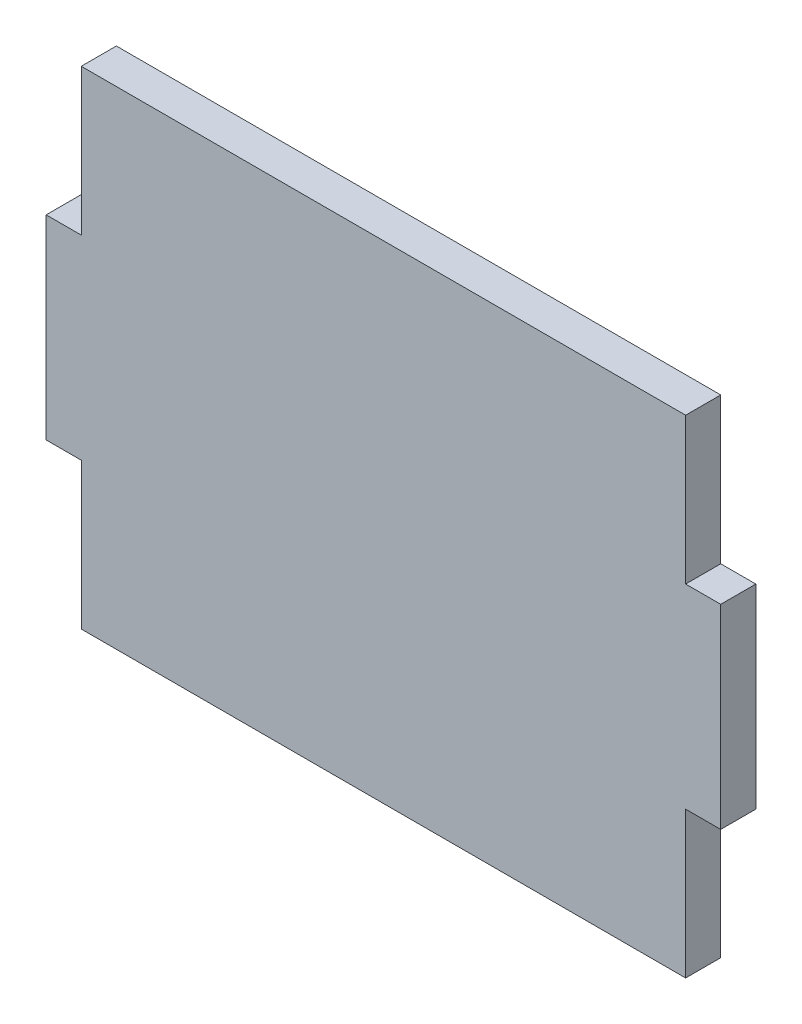
ISO-10303-21;
HEADER;
FILE_DESCRIPTION(('STEP AP214'),'2;1');
FILE_NAME('part.step','',(''),(''),'','','');
FILE_SCHEMA(('AUTOMOTIVE_DESIGN { 1 0 10303 214 1 1 1 1 }'));
ENDSEC;
DATA;
#1=APPLICATION_CONTEXT('core data for automotive mechanical design processes');
#2=APPLICATION_PROTOCOL_DEFINITION('international standard','automotive_design',2000,#1);
#3=PRODUCT_CONTEXT('',#1,'mechanical');
#4=PRODUCT('Part','Part','',(#3));
#5=PRODUCT_RELATED_PRODUCT_CATEGORY('part','',(#4));
#6=PRODUCT_DEFINITION_FORMATION('','',#4);
#7=PRODUCT_DEFINITION_CONTEXT('part definition',#1,'design');
#8=PRODUCT_DEFINITION('design','',#6,#7);
#9=PRODUCT_DEFINITION_SHAPE('','',#8);
#10=(LENGTH_UNIT() NAMED_UNIT(*) SI_UNIT(.MILLI.,.METRE.));
#11=(NAMED_UNIT(*) PLANE_ANGLE_UNIT() SI_UNIT($,.RADIAN.));
#12=(NAMED_UNIT(*) SI_UNIT($,.STERADIAN.) SOLID_ANGLE_UNIT());
#13=UNCERTAINTY_MEASURE_WITH_UNIT(LENGTH_MEASURE(1.E-05),#10,'distance_accuracy_value','');
#14=(GEOMETRIC_REPRESENTATION_CONTEXT(3) GLOBAL_UNCERTAINTY_ASSIGNED_CONTEXT((#13)) GLOBAL_UNIT_ASSIGNED_CONTEXT((#10,
#11,#12)) REPRESENTATION_CONTEXT('',''));
#15=CARTESIAN_POINT('',(0.,0.,0.));
#16=DIRECTION('',(0.,0.,1.));
#17=DIRECTION('',(1.,0.,0.));
#18=AXIS2_PLACEMENT_3D('',#15,#16,#17);
#19=CARTESIAN_POINT('',(0.,0.,18.));
#20=DIRECTION('',(1.,0.,0.));
#21=DIRECTION('',(0.,1.,0.));
#22=AXIS2_PLACEMENT_3D('',#19,#20,#21);
#23=PLANE('',#22);
#24=DIRECTION('',(0.,-1.,0.));
#25=VECTOR('',#24,1.);
#26=CARTESIAN_POINT('',(0.,0.,0.));
#27=LINE('',#26,#25);
#28=CARTESIAN_POINT('',(0.,0.,0.));
#29=VERTEX_POINT('',#28);
#30=CARTESIAN_POINT('',(0.,-75.,0.));
#31=VERTEX_POINT('',#30);
#32=EDGE_CURVE('E153',#29,#31,#27,.T.);
#33=ORIENTED_EDGE('',*,*,#32,.T.);
#34=DIRECTION('',(0.,0.,-1.));
#35=VECTOR('',#34,1.);
#36=CARTESIAN_POINT('',(0.,-75.,18.));
#37=LINE('',#36,#35);
#38=CARTESIAN_POINT('',(0.,-75.,18.));
#39=VERTEX_POINT('',#38);
#40=EDGE_CURVE('E11',#39,#31,#37,.T.);
#41=ORIENTED_EDGE('',*,*,#40,.F.);
#42=DIRECTION('',(0.,-1.,0.));
#43=VECTOR('',#42,1.);
#44=CARTESIAN_POINT('',(0.,0.,18.));
#45=LINE('',#44,#43);
#46=CARTESIAN_POINT('',(0.,0.,18.));
#47=VERTEX_POINT('',#46);
#48=EDGE_CURVE('E175',#47,#39,#45,.T.);
#49=ORIENTED_EDGE('',*,*,#48,.F.);
#50=DIRECTION('',(0.,0.,-1.));
#51=VECTOR('',#50,1.);
#52=CARTESIAN_POINT('',(0.,0.,18.));
#53=LINE('',#52,#51);
#54=EDGE_CURVE('E149',#47,#29,#53,.T.);
#55=ORIENTED_EDGE('',*,*,#54,.T.);
#56=EDGE_LOOP('',(#33,#41,#49,#55));
#57=FACE_BOUND('',#56,.T.);
#58=ADVANCED_FACE('F33',(#57),#23,.F.);
#59=CARTESIAN_POINT('',(-18.,-75.,18.));
#60=DIRECTION('',(0.,-1.,0.));
#61=DIRECTION('',(0.,0.,-1.));
#62=AXIS2_PLACEMENT_3D('',#59,#60,#61);
#63=PLANE('',#62);
#64=DIRECTION('',(-1.,0.,0.));
#65=VECTOR('',#64,1.);
#66=CARTESIAN_POINT('',(-18.,-75.,0.));
#67=LINE('',#66,#65);
#68=CARTESIAN_POINT('',(-18.,-75.,0.));
#69=VERTEX_POINT('',#68);
#70=EDGE_CURVE('E156',#31,#69,#67,.T.);
#71=ORIENTED_EDGE('',*,*,#70,.T.);
#72=DIRECTION('',(0.,0.,-1.));
#73=VECTOR('',#72,1.);
#74=CARTESIAN_POINT('',(-18.,-75.,18.));
#75=LINE('',#74,#73);
#76=CARTESIAN_POINT('',(-18.,-75.,18.));
#77=VERTEX_POINT('',#76);
#78=EDGE_CURVE('E41',#77,#69,#75,.T.);
#79=ORIENTED_EDGE('',*,*,#78,.F.);
#80=DIRECTION('',(-1.,0.,0.));
#81=VECTOR('',#80,1.);
#82=CARTESIAN_POINT('',(-18.,-75.,18.));
#83=LINE('',#82,#81);
#84=EDGE_CURVE('E104',#39,#77,#83,.T.);
#85=ORIENTED_EDGE('',*,*,#84,.F.);
#86=ORIENTED_EDGE('',*,*,#40,.T.);
#87=EDGE_LOOP('',(#71,#79,#85,#86));
#88=FACE_BOUND('',#87,.T.);
#89=ADVANCED_FACE('F253',(#88),#63,.F.);
#90=CARTESIAN_POINT('',(-18.,-75.,18.));
#91=DIRECTION('',(1.,0.,0.));
#92=DIRECTION('',(0.,1.,0.));
#93=AXIS2_PLACEMENT_3D('',#90,#91,#92);
#94=PLANE('',#93);
#95=DIRECTION('',(0.,-1.,0.));
#96=VECTOR('',#95,1.);
#97=CARTESIAN_POINT('',(-18.,-75.,0.));
#98=LINE('',#97,#96);
#99=CARTESIAN_POINT('',(-18.,-175.,0.));
#100=VERTEX_POINT('',#99);
#101=EDGE_CURVE('E158',#69,#100,#98,.T.);
#102=ORIENTED_EDGE('',*,*,#101,.T.);
#103=DIRECTION('',(0.,0.,-1.));
#104=VECTOR('',#103,1.);
#105=CARTESIAN_POINT('',(-18.,-175.,18.));
#106=LINE('',#105,#104);
#107=CARTESIAN_POINT('',(-18.,-175.,18.));
#108=VERTEX_POINT('',#107);
#109=EDGE_CURVE('E194',#108,#100,#106,.T.);
#110=ORIENTED_EDGE('',*,*,#109,.F.);
#111=DIRECTION('',(0.,-1.,0.));
#112=VECTOR('',#111,1.);
#113=CARTESIAN_POINT('',(-18.,-75.,18.));
#114=LINE('',#113,#112);
#115=EDGE_CURVE('E202',#77,#108,#114,.T.);
#116=ORIENTED_EDGE('',*,*,#115,.F.);
#117=ORIENTED_EDGE('',*,*,#78,.T.);
#118=EDGE_LOOP('',(#102,#110,#116,#117));
#119=FACE_BOUND('',#118,.T.);
#120=ADVANCED_FACE('F200',(#119),#94,.F.);
#121=CARTESIAN_POINT('',(-18.,-175.,18.));
#122=DIRECTION('',(0.,1.,0.));
#123=DIRECTION('',(0.,0.,1.));
#124=AXIS2_PLACEMENT_3D('',#121,#122,#123);
#125=PLANE('',#124);
#126=DIRECTION('',(1.,0.,0.));
#127=VECTOR('',#126,1.);
#128=CARTESIAN_POINT('',(-18.,-175.,0.));
#129=LINE('',#128,#127);
#130=CARTESIAN_POINT('',(0.,-175.,0.));
#131=VERTEX_POINT('',#130);
#132=EDGE_CURVE('E160',#100,#131,#129,.T.);
#133=ORIENTED_EDGE('',*,*,#132,.T.);
#134=DIRECTION('',(0.,0.,-1.));
#135=VECTOR('',#134,1.);
#136=CARTESIAN_POINT('',(0.,-175.,18.));
#137=LINE('',#136,#135);
#138=CARTESIAN_POINT('',(0.,-175.,18.));
#139=VERTEX_POINT('',#138);
#140=EDGE_CURVE('E191',#139,#131,#137,.T.);
#141=ORIENTED_EDGE('',*,*,#140,.F.);
#142=DIRECTION('',(1.,0.,0.));
#143=VECTOR('',#142,1.);
#144=CARTESIAN_POINT('',(-18.,-175.,18.));
#145=LINE('',#144,#143);
#146=EDGE_CURVE('E220',#108,#139,#145,.T.);
#147=ORIENTED_EDGE('',*,*,#146,.F.);
#148=ORIENTED_EDGE('',*,*,#109,.T.);
#149=EDGE_LOOP('',(#133,#141,#147,#148));
#150=FACE_BOUND('',#149,.T.);
#151=ADVANCED_FACE('F211',(#150),#125,.F.);
#152=CARTESIAN_POINT('',(0.,-175.,18.));
#153=DIRECTION('',(1.,0.,0.));
#154=DIRECTION('',(0.,0.,-1.));
#155=AXIS2_PLACEMENT_3D('',#152,#153,#154);
#156=PLANE('',#155);
#157=DIRECTION('',(0.,-1.,0.));
#158=VECTOR('',#157,1.);
#159=CARTESIAN_POINT('',(0.,-175.,0.));
#160=LINE('',#159,#158);
#161=CARTESIAN_POINT('',(0.,-250.,0.));
#162=VERTEX_POINT('',#161);
#163=EDGE_CURVE('E162',#131,#162,#160,.T.);
#164=ORIENTED_EDGE('',*,*,#163,.T.);
#165=DIRECTION('',(0.,0.,-1.));
#166=VECTOR('',#165,1.);
#167=CARTESIAN_POINT('',(0.,-250.,18.));
#168=LINE('',#167,#166);
#169=CARTESIAN_POINT('',(0.,-250.,18.));
#170=VERTEX_POINT('',#169);
#171=EDGE_CURVE('E188',#170,#162,#168,.T.);
#172=ORIENTED_EDGE('',*,*,#171,.F.);
#173=DIRECTION('',(0.,-1.,0.));
#174=VECTOR('',#173,1.);
#175=CARTESIAN_POINT('',(0.,-175.,18.));
#176=LINE('',#175,#174);
#177=EDGE_CURVE('E217',#139,#170,#176,.T.);
#178=ORIENTED_EDGE('',*,*,#177,.F.);
#179=ORIENTED_EDGE('',*,*,#140,.T.);
#180=EDGE_LOOP('',(#164,#172,#178,#179));
#181=FACE_BOUND('',#180,.T.);
#182=ADVANCED_FACE('F215',(#181),#156,.F.);
#183=CARTESIAN_POINT('',(0.,-250.,18.));
#184=DIRECTION('',(0.,1.,0.));
#185=DIRECTION('',(0.,0.,1.));
#186=AXIS2_PLACEMENT_3D('',#183,#184,#185);
#187=PLANE('',#186);
#188=DIRECTION('',(1.,0.,0.));
#189=VECTOR('',#188,1.);
#190=CARTESIAN_POINT('',(0.,-250.,0.));
#191=LINE('',#190,#189);
#192=CARTESIAN_POINT('',(310.,-250.,0.));
#193=VERTEX_POINT('',#192);
#194=EDGE_CURVE('E164',#162,#193,#191,.T.);
#195=ORIENTED_EDGE('',*,*,#194,.T.);
#196=DIRECTION('',(0.,0.,-1.));
#197=VECTOR('',#196,1.);
#198=CARTESIAN_POINT('',(310.,-250.,18.));
#199=LINE('',#198,#197);
#200=CARTESIAN_POINT('',(310.,-250.,18.));
#201=VERTEX_POINT('',#200);
#202=EDGE_CURVE('E185',#201,#193,#199,.T.);
#203=ORIENTED_EDGE('',*,*,#202,.F.);
#204=DIRECTION('',(1.,0.,0.));
#205=VECTOR('',#204,1.);
#206=CARTESIAN_POINT('',(0.,-250.,18.));
#207=LINE('',#206,#205);
#208=EDGE_CURVE('E219',#170,#201,#207,.T.);
#209=ORIENTED_EDGE('',*,*,#208,.F.);
#210=ORIENTED_EDGE('',*,*,#171,.T.);
#211=EDGE_LOOP('',(#195,#203,#209,#210));
#212=FACE_BOUND('',#211,.T.);
#213=ADVANCED_FACE('F266',(#212),#187,.F.);
#214=CARTESIAN_POINT('',(310.,-175.,18.));
#215=DIRECTION('',(-1.,0.,0.));
#216=DIRECTION('',(0.,-1.,0.));
#217=AXIS2_PLACEMENT_3D('',#214,#215,#216);
#218=PLANE('',#217);
#219=DIRECTION('',(0.,1.,0.));
#220=VECTOR('',#219,1.);
#221=CARTESIAN_POINT('',(310.,-175.,0.));
#222=LINE('',#221,#220);
#223=CARTESIAN_POINT('',(310.,-175.,0.));
#224=VERTEX_POINT('',#223);
#225=EDGE_CURVE('E166',#193,#224,#222,.T.);
#226=ORIENTED_EDGE('',*,*,#225,.T.);
#227=DIRECTION('',(0.,0.,-1.));
#228=VECTOR('',#227,1.);
#229=CARTESIAN_POINT('',(310.,-175.,18.));
#230=LINE('',#229,#228);
#231=CARTESIAN_POINT('',(310.,-175.,18.));
#232=VERTEX_POINT('',#231);
#233=EDGE_CURVE('E182',#232,#224,#230,.T.);
#234=ORIENTED_EDGE('',*,*,#233,.F.);
#235=DIRECTION('',(0.,1.,0.));
#236=VECTOR('',#235,1.);
#237=CARTESIAN_POINT('',(310.,-175.,18.));
#238=LINE('',#237,#236);
#239=EDGE_CURVE('E222',#201,#232,#238,.T.);
#240=ORIENTED_EDGE('',*,*,#239,.F.);
#241=ORIENTED_EDGE('',*,*,#202,.T.);
#242=EDGE_LOOP('',(#226,#234,#240,#241));
#243=FACE_BOUND('',#242,.T.);
#244=ADVANCED_FACE('F269',(#243),#218,.F.);
#245=CARTESIAN_POINT('',(328.,-175.,18.));
#246=DIRECTION('',(0.,1.,0.));
#247=DIRECTION('',(0.,0.,1.));
#248=AXIS2_PLACEMENT_3D('',#245,#246,#247);
#249=PLANE('',#248);
#250=DIRECTION('',(1.,0.,0.));
#251=VECTOR('',#250,1.);
#252=CARTESIAN_POINT('',(328.,-175.,0.));
#253=LINE('',#252,#251);
#254=CARTESIAN_POINT('',(328.,-175.,0.));
#255=VERTEX_POINT('',#254);
#256=EDGE_CURVE('E168',#224,#255,#253,.T.);
#257=ORIENTED_EDGE('',*,*,#256,.T.);
#258=DIRECTION('',(0.,0.,-1.));
#259=VECTOR('',#258,1.);
#260=CARTESIAN_POINT('',(328.,-175.,18.));
#261=LINE('',#260,#259);
#262=CARTESIAN_POINT('',(328.,-175.,18.));
#263=VERTEX_POINT('',#262);
#264=EDGE_CURVE('E179',#263,#255,#261,.T.);
#265=ORIENTED_EDGE('',*,*,#264,.F.);
#266=DIRECTION('',(1.,0.,0.));
#267=VECTOR('',#266,1.);
#268=CARTESIAN_POINT('',(328.,-175.,18.));
#269=LINE('',#268,#267);
#270=EDGE_CURVE('E228',#232,#263,#269,.T.);
#271=ORIENTED_EDGE('',*,*,#270,.F.);
#272=ORIENTED_EDGE('',*,*,#233,.T.);
#273=EDGE_LOOP('',(#257,#265,#271,#272));
#274=FACE_BOUND('',#273,.T.);
#275=ADVANCED_FACE('F234',(#274),#249,.F.);
#276=CARTESIAN_POINT('',(328.,-75.,18.));
#277=DIRECTION('',(-1.,0.,0.));
#278=DIRECTION('',(0.,-1.,0.));
#279=AXIS2_PLACEMENT_3D('',#276,#277,#278);
#280=PLANE('',#279);
#281=DIRECTION('',(0.,1.,0.));
#282=VECTOR('',#281,1.);
#283=CARTESIAN_POINT('',(328.,-75.,0.));
#284=LINE('',#283,#282);
#285=CARTESIAN_POINT('',(328.,-75.,0.));
#286=VERTEX_POINT('',#285);
#287=EDGE_CURVE('E170',#255,#286,#284,.T.);
#288=ORIENTED_EDGE('',*,*,#287,.T.);
#289=DIRECTION('',(0.,0.,-1.));
#290=VECTOR('',#289,1.);
#291=CARTESIAN_POINT('',(328.,-75.,18.));
#292=LINE('',#291,#290);
#293=CARTESIAN_POINT('',(328.,-75.,18.));
#294=VERTEX_POINT('',#293);
#295=EDGE_CURVE('E144',#294,#286,#292,.T.);
#296=ORIENTED_EDGE('',*,*,#295,.F.);
#297=DIRECTION('',(0.,1.,0.));
#298=VECTOR('',#297,1.);
#299=CARTESIAN_POINT('',(328.,-75.,18.));
#300=LINE('',#299,#298);
#301=EDGE_CURVE('E135',#263,#294,#300,.T.);
#302=ORIENTED_EDGE('',*,*,#301,.F.);
#303=ORIENTED_EDGE('',*,*,#264,.T.);
#304=EDGE_LOOP('',(#288,#296,#302,#303));
#305=FACE_BOUND('',#304,.T.);
#306=ADVANCED_FACE('F238',(#305),#280,.F.);
#307=CARTESIAN_POINT('',(328.,-75.,18.));
#308=DIRECTION('',(0.,-1.,0.));
#309=DIRECTION('',(0.,0.,-1.));
#310=AXIS2_PLACEMENT_3D('',#307,#308,#309);
#311=PLANE('',#310);
#312=DIRECTION('',(-1.,0.,0.));
#313=VECTOR('',#312,1.);
#314=CARTESIAN_POINT('',(328.,-75.,0.));
#315=LINE('',#314,#313);
#316=CARTESIAN_POINT('',(310.,-75.,0.));
#317=VERTEX_POINT('',#316);
#318=EDGE_CURVE('E143',#286,#317,#315,.T.);
#319=ORIENTED_EDGE('',*,*,#318,.T.);
#320=DIRECTION('',(0.,0.,-1.));
#321=VECTOR('',#320,1.);
#322=CARTESIAN_POINT('',(310.,-75.,18.));
#323=LINE('',#322,#321);
#324=CARTESIAN_POINT('',(310.,-75.,18.));
#325=VERTEX_POINT('',#324);
#326=EDGE_CURVE('E140',#325,#317,#323,.T.);
#327=ORIENTED_EDGE('',*,*,#326,.F.);
#328=DIRECTION('',(-1.,0.,0.));
#329=VECTOR('',#328,1.);
#330=CARTESIAN_POINT('',(328.,-75.,18.));
#331=LINE('',#330,#329);
#332=EDGE_CURVE('E129',#294,#325,#331,.T.);
#333=ORIENTED_EDGE('',*,*,#332,.F.);
#334=ORIENTED_EDGE('',*,*,#295,.T.);
#335=EDGE_LOOP('',(#319,#327,#333,#334));
#336=FACE_BOUND('',#335,.T.);
#337=ADVANCED_FACE('F141',(#336),#311,.F.);
#338=CARTESIAN_POINT('',(310.,0.,18.));
#339=DIRECTION('',(-1.,0.,0.));
#340=DIRECTION('',(0.,0.,1.));
#341=AXIS2_PLACEMENT_3D('',#338,#339,#340);
#342=PLANE('',#341);
#343=DIRECTION('',(0.,1.,0.));
#344=VECTOR('',#343,1.);
#345=CARTESIAN_POINT('',(310.,0.,0.));
#346=LINE('',#345,#344);
#347=CARTESIAN_POINT('',(310.,0.,0.));
#348=VERTEX_POINT('',#347);
#349=EDGE_CURVE('E90',#317,#348,#346,.T.);
#350=ORIENTED_EDGE('',*,*,#349,.T.);
#351=DIRECTION('',(0.,0.,-1.));
#352=VECTOR('',#351,1.);
#353=CARTESIAN_POINT('',(310.,0.,18.));
#354=LINE('',#353,#352);
#355=CARTESIAN_POINT('',(310.,0.,18.));
#356=VERTEX_POINT('',#355);
#357=EDGE_CURVE('E145',#356,#348,#354,.T.);
#358=ORIENTED_EDGE('',*,*,#357,.F.);
#359=DIRECTION('',(0.,1.,0.));
#360=VECTOR('',#359,1.);
#361=CARTESIAN_POINT('',(310.,0.,18.));
#362=LINE('',#361,#360);
#363=EDGE_CURVE('E133',#325,#356,#362,.T.);
#364=ORIENTED_EDGE('',*,*,#363,.F.);
#365=ORIENTED_EDGE('',*,*,#326,.T.);
#366=EDGE_LOOP('',(#350,#358,#364,#365));
#367=FACE_BOUND('',#366,.T.);
#368=ADVANCED_FACE('F147',(#367),#342,.F.);
#369=CARTESIAN_POINT('',(0.,0.,18.));
#370=DIRECTION('',(0.,-1.,0.));
#371=DIRECTION('',(0.,0.,-1.));
#372=AXIS2_PLACEMENT_3D('',#369,#370,#371);
#373=PLANE('',#372);
#374=DIRECTION('',(-1.,0.,0.));
#375=VECTOR('',#374,1.);
#376=CARTESIAN_POINT('',(0.,0.,0.));
#377=LINE('',#376,#375);
#378=EDGE_CURVE('E96',#348,#29,#377,.T.);
#379=ORIENTED_EDGE('',*,*,#378,.T.);
#380=ORIENTED_EDGE('',*,*,#54,.F.);
#381=DIRECTION('',(-1.,0.,0.));
#382=VECTOR('',#381,1.);
#383=CARTESIAN_POINT('',(0.,0.,18.));
#384=LINE('',#383,#382);
#385=EDGE_CURVE('E49',#356,#47,#384,.T.);
#386=ORIENTED_EDGE('',*,*,#385,.F.);
#387=ORIENTED_EDGE('',*,*,#357,.T.);
#388=EDGE_LOOP('',(#379,#380,#386,#387));
#389=FACE_BOUND('',#388,.T.);
#390=ADVANCED_FACE('F242',(#389),#373,.F.);
#391=CARTESIAN_POINT('',(0.,0.,18.));
#392=DIRECTION('',(0.,0.,1.));
#393=DIRECTION('',(1.,0.,0.));
#394=AXIS2_PLACEMENT_3D('',#391,#392,#393);
#395=PLANE('',#394);
#396=ORIENTED_EDGE('',*,*,#48,.T.);
#397=ORIENTED_EDGE('',*,*,#84,.T.);
#398=ORIENTED_EDGE('',*,*,#115,.T.);
#399=ORIENTED_EDGE('',*,*,#146,.T.);
#400=ORIENTED_EDGE('',*,*,#177,.T.);
#401=ORIENTED_EDGE('',*,*,#208,.T.);
#402=ORIENTED_EDGE('',*,*,#239,.T.);
#403=ORIENTED_EDGE('',*,*,#270,.T.);
#404=ORIENTED_EDGE('',*,*,#301,.T.);
#405=ORIENTED_EDGE('',*,*,#332,.T.);
#406=ORIENTED_EDGE('',*,*,#363,.T.);
#407=ORIENTED_EDGE('',*,*,#385,.T.);
#408=EDGE_LOOP('',(#396,#397,#398,#399,#400,#401,#402,#403,#404,#405,#406,#407));
#409=FACE_BOUND('',#408,.T.);
#410=ADVANCED_FACE('F131',(#409),#395,.T.);
#411=CARTESIAN_POINT('',(0.,0.,0.));
#412=DIRECTION('',(0.,0.,1.));
#413=DIRECTION('',(1.,0.,0.));
#414=AXIS2_PLACEMENT_3D('',#411,#412,#413);
#415=PLANE('',#414);
#416=ORIENTED_EDGE('',*,*,#32,.F.);
#417=ORIENTED_EDGE('',*,*,#378,.F.);
#418=ORIENTED_EDGE('',*,*,#349,.F.);
#419=ORIENTED_EDGE('',*,*,#318,.F.);
#420=ORIENTED_EDGE('',*,*,#287,.F.);
#421=ORIENTED_EDGE('',*,*,#256,.F.);
#422=ORIENTED_EDGE('',*,*,#225,.F.);
#423=ORIENTED_EDGE('',*,*,#194,.F.);
#424=ORIENTED_EDGE('',*,*,#163,.F.);
#425=ORIENTED_EDGE('',*,*,#132,.F.);
#426=ORIENTED_EDGE('',*,*,#101,.F.);
#427=ORIENTED_EDGE('',*,*,#70,.F.);
#428=EDGE_LOOP('',(#416,#417,#418,#419,#420,#421,#422,#423,#424,#425,#426,#427));
#429=FACE_BOUND('',#428,.T.);
#430=ADVANCED_FACE('F206',(#429),#415,.F.);
#431=CLOSED_SHELL('',(#58,#89,#120,#151,#182,#213,#244,#275,#306,#337,#368,#390,#410,#430));
#432=MANIFOLD_SOLID_BREP('B2',#431);
#433=ADVANCED_BREP_SHAPE_REPRESENTATION('',(#18,#432),#14);
#434=SHAPE_DEFINITION_REPRESENTATION(#9,#433);
ENDSEC;
END-ISO-10303-21;
